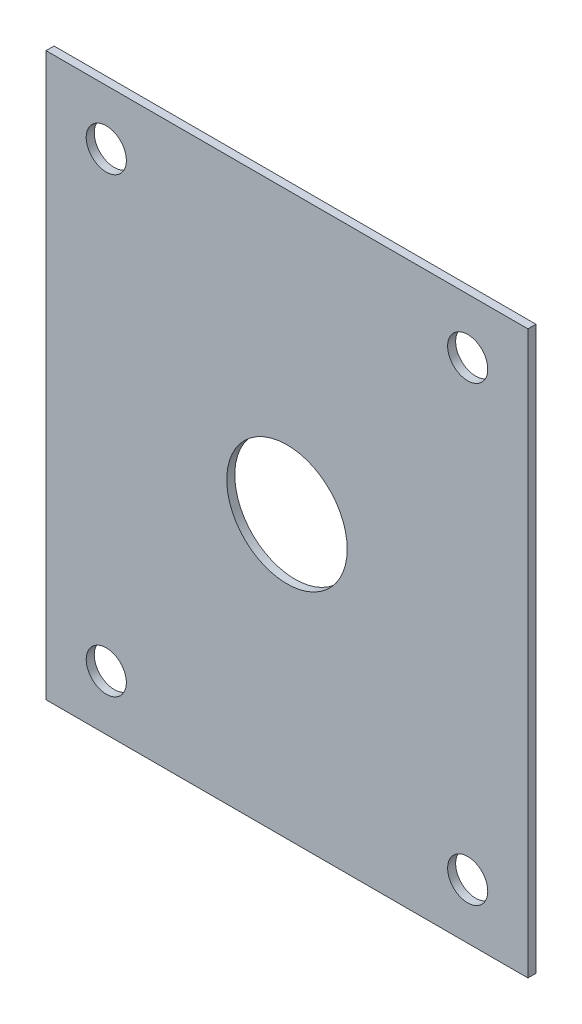
ISO-10303-21;
HEADER;
FILE_DESCRIPTION(('STEP AP214'),'2;1');
FILE_NAME('part.step','',(''),(''),'','','');
FILE_SCHEMA(('AUTOMOTIVE_DESIGN { 1 0 10303 214 1 1 1 1 }'));
ENDSEC;
DATA;
#1=APPLICATION_CONTEXT('core data for automotive mechanical design processes');
#2=APPLICATION_PROTOCOL_DEFINITION('international standard','automotive_design',2000,#1);
#3=PRODUCT_CONTEXT('',#1,'mechanical');
#4=PRODUCT('Part','Part','',(#3));
#5=PRODUCT_RELATED_PRODUCT_CATEGORY('part','',(#4));
#6=PRODUCT_DEFINITION_FORMATION('','',#4);
#7=PRODUCT_DEFINITION_CONTEXT('part definition',#1,'design');
#8=PRODUCT_DEFINITION('design','',#6,#7);
#9=PRODUCT_DEFINITION_SHAPE('','',#8);
#10=(LENGTH_UNIT() NAMED_UNIT(*) SI_UNIT(.MILLI.,.METRE.));
#11=(NAMED_UNIT(*) PLANE_ANGLE_UNIT() SI_UNIT($,.RADIAN.));
#12=(NAMED_UNIT(*) SI_UNIT($,.STERADIAN.) SOLID_ANGLE_UNIT());
#13=UNCERTAINTY_MEASURE_WITH_UNIT(LENGTH_MEASURE(1.E-05),#10,'distance_accuracy_value','');
#14=(GEOMETRIC_REPRESENTATION_CONTEXT(3) GLOBAL_UNCERTAINTY_ASSIGNED_CONTEXT((#13)) GLOBAL_UNIT_ASSIGNED_CONTEXT((#10,
#11,#12)) REPRESENTATION_CONTEXT('',''));
#15=CARTESIAN_POINT('',(0.,0.,0.));
#16=DIRECTION('',(0.,0.,1.));
#17=DIRECTION('',(1.,0.,0.));
#18=AXIS2_PLACEMENT_3D('',#15,#16,#17);
#19=CARTESIAN_POINT('',(0.,0.,2.54));
#20=DIRECTION('',(0.,0.,-1.));
#21=DIRECTION('',(-1.,0.,0.));
#22=AXIS2_PLACEMENT_3D('',#19,#20,#21);
#23=PLANE('',#22);
#24=CARTESIAN_POINT('',(133.35,17.399,2.54));
#25=DIRECTION('',(0.,0.,1.));
#26=DIRECTION('',(1.,0.,0.));
#27=AXIS2_PLACEMENT_3D('',#24,#25,#26);
#28=CIRCLE('',#27,6.35000000000002);
#29=CARTESIAN_POINT('',(139.7,17.399,2.54));
#30=VERTEX_POINT('',#29);
#31=EDGE_CURVE('E127',#30,#30,#28,.T.);
#32=ORIENTED_EDGE('',*,*,#31,.F.);
#33=EDGE_LOOP('',(#32));
#34=FACE_BOUND('',#33,.T.);
#35=CARTESIAN_POINT('',(19.05,160.401,2.54));
#36=DIRECTION('',(0.,0.,1.));
#37=DIRECTION('',(1.,0.,0.));
#38=AXIS2_PLACEMENT_3D('',#35,#36,#37);
#39=CIRCLE('',#38,6.35);
#40=CARTESIAN_POINT('',(25.4,160.401,2.54));
#41=VERTEX_POINT('',#40);
#42=EDGE_CURVE('E115',#41,#41,#39,.T.);
#43=ORIENTED_EDGE('',*,*,#42,.F.);
#44=EDGE_LOOP('',(#43));
#45=FACE_BOUND('',#44,.T.);
#46=DIRECTION('',(0.,-1.,0.));
#47=VECTOR('',#46,1.);
#48=CARTESIAN_POINT('',(0.,0.,2.54));
#49=LINE('',#48,#47);
#50=CARTESIAN_POINT('',(0.,177.8,2.54));
#51=VERTEX_POINT('',#50);
#52=CARTESIAN_POINT('',(0.,0.,2.54));
#53=VERTEX_POINT('',#52);
#54=EDGE_CURVE('E85',#51,#53,#49,.T.);
#55=ORIENTED_EDGE('',*,*,#54,.T.);
#56=DIRECTION('',(1.,0.,0.));
#57=VECTOR('',#56,1.);
#58=CARTESIAN_POINT('',(0.,0.,2.54));
#59=LINE('',#58,#57);
#60=CARTESIAN_POINT('',(152.4,0.,2.54));
#61=VERTEX_POINT('',#60);
#62=EDGE_CURVE('E80',#53,#61,#59,.T.);
#63=ORIENTED_EDGE('',*,*,#62,.T.);
#64=DIRECTION('',(0.,1.,0.));
#65=VECTOR('',#64,1.);
#66=CARTESIAN_POINT('',(152.4,0.,2.54));
#67=LINE('',#66,#65);
#68=CARTESIAN_POINT('',(152.4,177.8,2.54));
#69=VERTEX_POINT('',#68);
#70=EDGE_CURVE('E83',#61,#69,#67,.T.);
#71=ORIENTED_EDGE('',*,*,#70,.T.);
#72=DIRECTION('',(-1.,0.,0.));
#73=VECTOR('',#72,1.);
#74=CARTESIAN_POINT('',(0.,177.8,2.54));
#75=LINE('',#74,#73);
#76=EDGE_CURVE('E50',#69,#51,#75,.T.);
#77=ORIENTED_EDGE('',*,*,#76,.T.);
#78=EDGE_LOOP('',(#55,#63,#71,#77));
#79=FACE_BOUND('',#78,.T.);
#80=CARTESIAN_POINT('',(76.2,88.9,2.54));
#81=DIRECTION('',(0.,0.,1.));
#82=DIRECTION('',(1.,0.,0.));
#83=AXIS2_PLACEMENT_3D('',#80,#81,#82);
#84=CIRCLE('',#83,19.05);
#85=CARTESIAN_POINT('',(95.25,88.9,2.54));
#86=VERTEX_POINT('',#85);
#87=EDGE_CURVE('E100',#86,#86,#84,.T.);
#88=ORIENTED_EDGE('',*,*,#87,.F.);
#89=EDGE_LOOP('',(#88));
#90=FACE_BOUND('',#89,.T.);
#91=CARTESIAN_POINT('',(133.35,160.401,2.54));
#92=DIRECTION('',(0.,0.,1.));
#93=DIRECTION('',(-1.,0.,0.));
#94=AXIS2_PLACEMENT_3D('',#91,#92,#93);
#95=CIRCLE('',#94,6.35000000000002);
#96=CARTESIAN_POINT('',(127.,160.401,2.54));
#97=VERTEX_POINT('',#96);
#98=EDGE_CURVE('E121',#97,#97,#95,.T.);
#99=ORIENTED_EDGE('',*,*,#98,.F.);
#100=EDGE_LOOP('',(#99));
#101=FACE_BOUND('',#100,.T.);
#102=CARTESIAN_POINT('',(19.05,17.399,2.54));
#103=DIRECTION('',(0.,0.,1.));
#104=DIRECTION('',(-1.,0.,0.));
#105=AXIS2_PLACEMENT_3D('',#102,#103,#104);
#106=CIRCLE('',#105,6.35);
#107=CARTESIAN_POINT('',(12.7,17.399,2.54));
#108=VERTEX_POINT('',#107);
#109=EDGE_CURVE('E133',#108,#108,#106,.T.);
#110=ORIENTED_EDGE('',*,*,#109,.F.);
#111=EDGE_LOOP('',(#110));
#112=FACE_BOUND('',#111,.T.);
#113=ADVANCED_FACE('F33',(#34,#45,#79,#90,#101,#112),#23,.F.);
#114=CARTESIAN_POINT('',(0.,0.,0.));
#115=DIRECTION('',(0.,0.,-1.));
#116=DIRECTION('',(-1.,0.,0.));
#117=AXIS2_PLACEMENT_3D('',#114,#115,#116);
#118=PLANE('',#117);
#119=CARTESIAN_POINT('',(133.35,17.399,0.));
#120=DIRECTION('',(0.,0.,1.));
#121=DIRECTION('',(1.,0.,0.));
#122=AXIS2_PLACEMENT_3D('',#119,#120,#121);
#123=CIRCLE('',#122,6.35000000000002);
#124=CARTESIAN_POINT('',(139.7,17.399,0.));
#125=VERTEX_POINT('',#124);
#126=EDGE_CURVE('E130',#125,#125,#123,.T.);
#127=ORIENTED_EDGE('',*,*,#126,.T.);
#128=EDGE_LOOP('',(#127));
#129=FACE_BOUND('',#128,.T.);
#130=CARTESIAN_POINT('',(19.05,160.401,0.));
#131=DIRECTION('',(0.,0.,1.));
#132=DIRECTION('',(1.,0.,0.));
#133=AXIS2_PLACEMENT_3D('',#130,#131,#132);
#134=CIRCLE('',#133,6.35);
#135=CARTESIAN_POINT('',(25.4,160.401,0.));
#136=VERTEX_POINT('',#135);
#137=EDGE_CURVE('E118',#136,#136,#134,.T.);
#138=ORIENTED_EDGE('',*,*,#137,.T.);
#139=EDGE_LOOP('',(#138));
#140=FACE_BOUND('',#139,.T.);
#141=DIRECTION('',(0.,-1.,0.));
#142=VECTOR('',#141,1.);
#143=CARTESIAN_POINT('',(0.,0.,0.));
#144=LINE('',#143,#142);
#145=CARTESIAN_POINT('',(0.,177.8,0.));
#146=VERTEX_POINT('',#145);
#147=CARTESIAN_POINT('',(0.,0.,0.));
#148=VERTEX_POINT('',#147);
#149=EDGE_CURVE('E97',#146,#148,#144,.T.);
#150=ORIENTED_EDGE('',*,*,#149,.F.);
#151=DIRECTION('',(-1.,0.,0.));
#152=VECTOR('',#151,1.);
#153=CARTESIAN_POINT('',(0.,177.8,0.));
#154=LINE('',#153,#152);
#155=CARTESIAN_POINT('',(152.4,177.8,0.));
#156=VERTEX_POINT('',#155);
#157=EDGE_CURVE('E73',#156,#146,#154,.T.);
#158=ORIENTED_EDGE('',*,*,#157,.F.);
#159=DIRECTION('',(0.,1.,0.));
#160=VECTOR('',#159,1.);
#161=CARTESIAN_POINT('',(152.4,0.,0.));
#162=LINE('',#161,#160);
#163=CARTESIAN_POINT('',(152.4,0.,0.));
#164=VERTEX_POINT('',#163);
#165=EDGE_CURVE('E67',#164,#156,#162,.T.);
#166=ORIENTED_EDGE('',*,*,#165,.F.);
#167=DIRECTION('',(1.,0.,0.));
#168=VECTOR('',#167,1.);
#169=CARTESIAN_POINT('',(0.,0.,0.));
#170=LINE('',#169,#168);
#171=EDGE_CURVE('E89',#148,#164,#170,.T.);
#172=ORIENTED_EDGE('',*,*,#171,.F.);
#173=EDGE_LOOP('',(#150,#158,#166,#172));
#174=FACE_BOUND('',#173,.T.);
#175=CARTESIAN_POINT('',(76.2,88.9,0.));
#176=DIRECTION('',(0.,0.,1.));
#177=DIRECTION('',(1.,0.,0.));
#178=AXIS2_PLACEMENT_3D('',#175,#176,#177);
#179=CIRCLE('',#178,19.05);
#180=CARTESIAN_POINT('',(95.25,88.9,0.));
#181=VERTEX_POINT('',#180);
#182=EDGE_CURVE('E112',#181,#181,#179,.T.);
#183=ORIENTED_EDGE('',*,*,#182,.T.);
#184=EDGE_LOOP('',(#183));
#185=FACE_BOUND('',#184,.T.);
#186=CARTESIAN_POINT('',(133.35,160.401,0.));
#187=DIRECTION('',(0.,0.,1.));
#188=DIRECTION('',(-1.,0.,0.));
#189=AXIS2_PLACEMENT_3D('',#186,#187,#188);
#190=CIRCLE('',#189,6.35000000000002);
#191=CARTESIAN_POINT('',(127.,160.401,0.));
#192=VERTEX_POINT('',#191);
#193=EDGE_CURVE('E124',#192,#192,#190,.T.);
#194=ORIENTED_EDGE('',*,*,#193,.T.);
#195=EDGE_LOOP('',(#194));
#196=FACE_BOUND('',#195,.T.);
#197=CARTESIAN_POINT('',(19.05,17.399,0.));
#198=DIRECTION('',(0.,0.,1.));
#199=DIRECTION('',(-1.,0.,0.));
#200=AXIS2_PLACEMENT_3D('',#197,#198,#199);
#201=CIRCLE('',#200,6.35);
#202=CARTESIAN_POINT('',(12.7,17.399,0.));
#203=VERTEX_POINT('',#202);
#204=EDGE_CURVE('E136',#203,#203,#201,.T.);
#205=ORIENTED_EDGE('',*,*,#204,.T.);
#206=EDGE_LOOP('',(#205));
#207=FACE_BOUND('',#206,.T.);
#208=ADVANCED_FACE('F108',(#129,#140,#174,#185,#196,#207),#118,.T.);
#209=CARTESIAN_POINT('',(0.,0.,2.54));
#210=DIRECTION('',(1.,0.,0.));
#211=DIRECTION('',(0.,0.,-1.));
#212=AXIS2_PLACEMENT_3D('',#209,#210,#211);
#213=PLANE('',#212);
#214=ORIENTED_EDGE('',*,*,#149,.T.);
#215=DIRECTION('',(0.,0.,-1.));
#216=VECTOR('',#215,1.);
#217=CARTESIAN_POINT('',(0.,0.,2.54));
#218=LINE('',#217,#216);
#219=EDGE_CURVE('E11',#53,#148,#218,.T.);
#220=ORIENTED_EDGE('',*,*,#219,.F.);
#221=ORIENTED_EDGE('',*,*,#54,.F.);
#222=DIRECTION('',(0.,0.,-1.));
#223=VECTOR('',#222,1.);
#224=CARTESIAN_POINT('',(0.,177.8,2.54));
#225=LINE('',#224,#223);
#226=EDGE_CURVE('E93',#51,#146,#225,.T.);
#227=ORIENTED_EDGE('',*,*,#226,.T.);
#228=EDGE_LOOP('',(#214,#220,#221,#227));
#229=FACE_BOUND('',#228,.T.);
#230=ADVANCED_FACE('F35',(#229),#213,.F.);
#231=CARTESIAN_POINT('',(0.,0.,2.54));
#232=DIRECTION('',(0.,1.,0.));
#233=DIRECTION('',(0.,0.,1.));
#234=AXIS2_PLACEMENT_3D('',#231,#232,#233);
#235=PLANE('',#234);
#236=ORIENTED_EDGE('',*,*,#171,.T.);
#237=DIRECTION('',(0.,0.,-1.));
#238=VECTOR('',#237,1.);
#239=CARTESIAN_POINT('',(152.4,0.,2.54));
#240=LINE('',#239,#238);
#241=EDGE_CURVE('E42',#61,#164,#240,.T.);
#242=ORIENTED_EDGE('',*,*,#241,.F.);
#243=ORIENTED_EDGE('',*,*,#62,.F.);
#244=ORIENTED_EDGE('',*,*,#219,.T.);
#245=EDGE_LOOP('',(#236,#242,#243,#244));
#246=FACE_BOUND('',#245,.T.);
#247=ADVANCED_FACE('F88',(#246),#235,.F.);
#248=CARTESIAN_POINT('',(152.4,0.,2.54));
#249=DIRECTION('',(-1.,0.,0.));
#250=DIRECTION('',(0.,0.,1.));
#251=AXIS2_PLACEMENT_3D('',#248,#249,#250);
#252=PLANE('',#251);
#253=ORIENTED_EDGE('',*,*,#165,.T.);
#254=DIRECTION('',(0.,0.,-1.));
#255=VECTOR('',#254,1.);
#256=CARTESIAN_POINT('',(152.4,177.8,2.54));
#257=LINE('',#256,#255);
#258=EDGE_CURVE('E90',#69,#156,#257,.T.);
#259=ORIENTED_EDGE('',*,*,#258,.F.);
#260=ORIENTED_EDGE('',*,*,#70,.F.);
#261=ORIENTED_EDGE('',*,*,#241,.T.);
#262=EDGE_LOOP('',(#253,#259,#260,#261));
#263=FACE_BOUND('',#262,.T.);
#264=ADVANCED_FACE('F91',(#263),#252,.F.);
#265=CARTESIAN_POINT('',(0.,177.8,2.54));
#266=DIRECTION('',(0.,-1.,0.));
#267=DIRECTION('',(0.,0.,-1.));
#268=AXIS2_PLACEMENT_3D('',#265,#266,#267);
#269=PLANE('',#268);
#270=ORIENTED_EDGE('',*,*,#157,.T.);
#271=ORIENTED_EDGE('',*,*,#226,.F.);
#272=ORIENTED_EDGE('',*,*,#76,.F.);
#273=ORIENTED_EDGE('',*,*,#258,.T.);
#274=EDGE_LOOP('',(#270,#271,#272,#273));
#275=FACE_BOUND('',#274,.T.);
#276=ADVANCED_FACE('F105',(#275),#269,.F.);
#277=CARTESIAN_POINT('',(76.2,88.9,2.54));
#278=DIRECTION('',(0.,0.,-1.));
#279=DIRECTION('',(-1.,0.,0.));
#280=AXIS2_PLACEMENT_3D('',#277,#278,#279);
#281=CYLINDRICAL_SURFACE('',#280,19.05);
#282=ORIENTED_EDGE('',*,*,#87,.T.);
#283=EDGE_LOOP('',(#282));
#284=FACE_BOUND('',#283,.T.);
#285=ORIENTED_EDGE('',*,*,#182,.F.);
#286=EDGE_LOOP('',(#285));
#287=FACE_BOUND('',#286,.T.);
#288=ADVANCED_FACE('F156',(#284,#287),#281,.F.);
#289=CARTESIAN_POINT('',(19.05,160.401,2.54));
#290=DIRECTION('',(0.,0.,-1.));
#291=DIRECTION('',(-1.,0.,0.));
#292=AXIS2_PLACEMENT_3D('',#289,#290,#291);
#293=CYLINDRICAL_SURFACE('',#292,6.35);
#294=ORIENTED_EDGE('',*,*,#42,.T.);
#295=EDGE_LOOP('',(#294));
#296=FACE_BOUND('',#295,.T.);
#297=ORIENTED_EDGE('',*,*,#137,.F.);
#298=EDGE_LOOP('',(#297));
#299=FACE_BOUND('',#298,.T.);
#300=ADVANCED_FACE('F181',(#296,#299),#293,.F.);
#301=CARTESIAN_POINT('',(133.35,160.401,2.54));
#302=DIRECTION('',(0.,0.,-1.));
#303=DIRECTION('',(-1.,0.,0.));
#304=AXIS2_PLACEMENT_3D('',#301,#302,#303);
#305=CYLINDRICAL_SURFACE('',#304,6.35000000000002);
#306=ORIENTED_EDGE('',*,*,#98,.T.);
#307=EDGE_LOOP('',(#306));
#308=FACE_BOUND('',#307,.T.);
#309=ORIENTED_EDGE('',*,*,#193,.F.);
#310=EDGE_LOOP('',(#309));
#311=FACE_BOUND('',#310,.T.);
#312=ADVANCED_FACE('F186',(#308,#311),#305,.F.);
#313=CARTESIAN_POINT('',(133.35,17.399,2.54));
#314=DIRECTION('',(0.,0.,-1.));
#315=DIRECTION('',(-1.,0.,0.));
#316=AXIS2_PLACEMENT_3D('',#313,#314,#315);
#317=CYLINDRICAL_SURFACE('',#316,6.35000000000002);
#318=ORIENTED_EDGE('',*,*,#31,.T.);
#319=EDGE_LOOP('',(#318));
#320=FACE_BOUND('',#319,.T.);
#321=ORIENTED_EDGE('',*,*,#126,.F.);
#322=EDGE_LOOP('',(#321));
#323=FACE_BOUND('',#322,.T.);
#324=ADVANCED_FACE('F196',(#320,#323),#317,.F.);
#325=CARTESIAN_POINT('',(19.05,17.399,2.54));
#326=DIRECTION('',(0.,0.,-1.));
#327=DIRECTION('',(-1.,0.,0.));
#328=AXIS2_PLACEMENT_3D('',#325,#326,#327);
#329=CYLINDRICAL_SURFACE('',#328,6.35);
#330=ORIENTED_EDGE('',*,*,#109,.T.);
#331=EDGE_LOOP('',(#330));
#332=FACE_BOUND('',#331,.T.);
#333=ORIENTED_EDGE('',*,*,#204,.F.);
#334=EDGE_LOOP('',(#333));
#335=FACE_BOUND('',#334,.T.);
#336=ADVANCED_FACE('F142',(#332,#335),#329,.F.);
#337=CLOSED_SHELL('',(#113,#208,#230,#247,#264,#276,#288,#300,#312,#324,#336));
#338=MANIFOLD_SOLID_BREP('B2',#337);
#339=ADVANCED_BREP_SHAPE_REPRESENTATION('',(#18,#338),#14);
#340=SHAPE_DEFINITION_REPRESENTATION(#9,#339);
ENDSEC;
END-ISO-10303-21;
